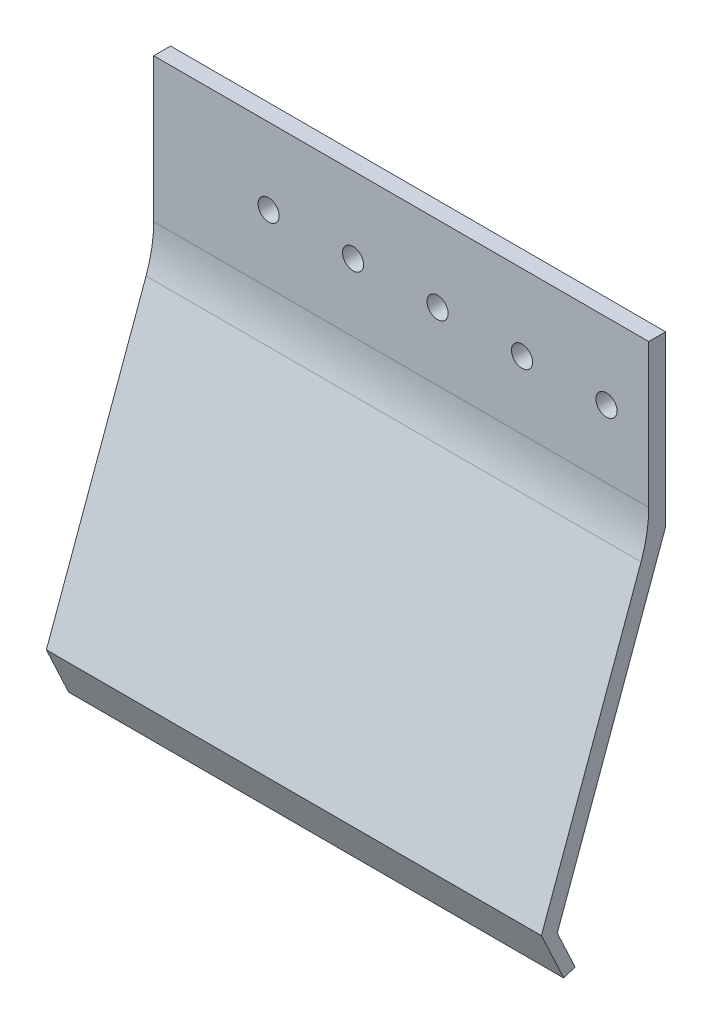
ISO-10303-21;
HEADER;
FILE_DESCRIPTION(('STEP AP214'),'2;1');
FILE_NAME('part.step','',(''),(''),'','','');
FILE_SCHEMA(('AUTOMOTIVE_DESIGN { 1 0 10303 214 1 1 1 1 }'));
ENDSEC;
DATA;
#1=APPLICATION_CONTEXT('core data for automotive mechanical design processes');
#2=APPLICATION_PROTOCOL_DEFINITION('international standard','automotive_design',2000,#1);
#3=PRODUCT_CONTEXT('',#1,'mechanical');
#4=PRODUCT('Part','Part','',(#3));
#5=PRODUCT_RELATED_PRODUCT_CATEGORY('part','',(#4));
#6=PRODUCT_DEFINITION_FORMATION('','',#4);
#7=PRODUCT_DEFINITION_CONTEXT('part definition',#1,'design');
#8=PRODUCT_DEFINITION('design','',#6,#7);
#9=PRODUCT_DEFINITION_SHAPE('','',#8);
#10=(LENGTH_UNIT() NAMED_UNIT(*) SI_UNIT(.MILLI.,.METRE.));
#11=(NAMED_UNIT(*) PLANE_ANGLE_UNIT() SI_UNIT($,.RADIAN.));
#12=(NAMED_UNIT(*) SI_UNIT($,.STERADIAN.) SOLID_ANGLE_UNIT());
#13=UNCERTAINTY_MEASURE_WITH_UNIT(LENGTH_MEASURE(1.E-05),#10,'distance_accuracy_value','');
#14=(GEOMETRIC_REPRESENTATION_CONTEXT(3) GLOBAL_UNCERTAINTY_ASSIGNED_CONTEXT((#13)) GLOBAL_UNIT_ASSIGNED_CONTEXT((#10,
#11,#12)) REPRESENTATION_CONTEXT('',''));
#15=CARTESIAN_POINT('',(0.,0.,0.));
#16=DIRECTION('',(0.,0.,1.));
#17=DIRECTION('',(1.,0.,0.));
#18=AXIS2_PLACEMENT_3D('',#15,#16,#17);
#19=CARTESIAN_POINT('',(37.2,0.,8.));
#20=DIRECTION('',(1.,0.,0.));
#21=DIRECTION('',(0.,0.,-1.));
#22=AXIS2_PLACEMENT_3D('',#19,#20,#21);
#23=PLANE('',#22);
#24=DIRECTION('',(0.,-1.,0.));
#25=VECTOR('',#24,1.);
#26=CARTESIAN_POINT('',(37.2,72.2,8.));
#27=LINE('',#26,#25);
#28=CARTESIAN_POINT('',(37.2,112.2,8.));
#29=VERTEX_POINT('',#28);
#30=CARTESIAN_POINT('',(37.2,72.2,8.));
#31=VERTEX_POINT('',#30);
#32=EDGE_CURVE('E166',#29,#31,#27,.T.);
#33=ORIENTED_EDGE('',*,*,#32,.F.);
#34=DIRECTION('',(0.,0.,1.));
#35=VECTOR('',#34,1.);
#36=CARTESIAN_POINT('',(37.2,112.2,0.));
#37=LINE('',#36,#35);
#38=CARTESIAN_POINT('',(37.2,112.2,12.));
#39=VERTEX_POINT('',#38);
#40=EDGE_CURVE('E11',#29,#39,#37,.T.);
#41=ORIENTED_EDGE('',*,*,#40,.T.);
#42=DIRECTION('',(0.,-1.,0.));
#43=VECTOR('',#42,1.);
#44=CARTESIAN_POINT('',(37.2,72.9053079228339,12.));
#45=LINE('',#44,#43);
#46=CARTESIAN_POINT('',(37.2,78.195117344088,12.));
#47=VERTEX_POINT('',#46);
#48=EDGE_CURVE('E112',#39,#47,#45,.T.);
#49=ORIENTED_EDGE('',*,*,#48,.T.);
#50=CARTESIAN_POINT('',(37.2,78.195117344088,42.));
#51=DIRECTION('',(-1.,0.,0.));
#52=DIRECTION('',(0.,0.,1.));
#53=AXIS2_PLACEMENT_3D('',#50,#51,#52);
#54=CIRCLE('',#53,30.);
#55=CARTESIAN_POINT('',(37.2,67.9345130443177,13.8092213764228));
#56=VERTEX_POINT('',#55);
#57=EDGE_CURVE('E45',#47,#56,#54,.T.);
#58=ORIENTED_EDGE('',*,*,#57,.T.);
#59=DIRECTION('',(0.,-0.939692620785906,0.342020143325676));
#60=VECTOR('',#59,1.);
#61=CARTESIAN_POINT('',(37.2,72.9053079228339,12.));
#62=LINE('',#61,#60);
#63=CARTESIAN_POINT('',(37.2,3.09113401435978,37.4102812325693));
#64=VERTEX_POINT('',#63);
#65=EDGE_CURVE('E170',#56,#64,#62,.T.);
#66=ORIENTED_EDGE('',*,*,#65,.T.);
#67=DIRECTION('',(0.,-0.906307787036651,-0.422618261740697));
#68=VECTOR('',#67,1.);
#69=CARTESIAN_POINT('',(37.2,3.09113401435978,37.4102812325693));
#70=LINE('',#69,#68);
#71=CARTESIAN_POINT('',(37.2,-8.23771332359837,32.1275529608106));
#72=VERTEX_POINT('',#71);
#73=EDGE_CURVE('E172',#64,#72,#70,.T.);
#74=ORIENTED_EDGE('',*,*,#73,.T.);
#75=DIRECTION('',(0.,0.315262717408907,-0.949004435717743));
#76=VECTOR('',#75,1.);
#77=CARTESIAN_POINT('',(37.2,-8.23771332359837,32.1275529608106));
#78=LINE('',#77,#76);
#79=CARTESIAN_POINT('',(37.2,-7.34002442930944,29.4253281320187));
#80=VERTEX_POINT('',#79);
#81=EDGE_CURVE('E175',#72,#80,#78,.T.);
#82=ORIENTED_EDGE('',*,*,#81,.T.);
#83=DIRECTION('',(0.,0.906307787036651,0.422618261740697));
#84=VECTOR('',#83,1.);
#85=CARTESIAN_POINT('',(37.2,1.72305344105708,33.6515107494257));
#86=LINE('',#85,#84);
#87=CARTESIAN_POINT('',(37.2,1.72305344105708,33.6515107494257));
#88=VERTEX_POINT('',#87);
#89=EDGE_CURVE('E178',#80,#88,#86,.T.);
#90=ORIENTED_EDGE('',*,*,#89,.T.);
#91=DIRECTION('',(0.,0.939692620785906,-0.342020143325676));
#92=VECTOR('',#91,1.);
#93=CARTESIAN_POINT('',(37.2,72.2,8.));
#94=LINE('',#93,#92);
#95=EDGE_CURVE('E116',#88,#31,#94,.T.);
#96=ORIENTED_EDGE('',*,*,#95,.T.);
#97=EDGE_LOOP('',(#33,#41,#49,#58,#66,#74,#82,#90,#96));
#98=FACE_BOUND('',#97,.T.);
#99=ADVANCED_FACE('F37',(#98),#23,.T.);
#100=CARTESIAN_POINT('',(-221.814036774629,112.2,0.));
#101=DIRECTION('',(0.,1.,0.));
#102=DIRECTION('',(0.,0.,1.));
#103=AXIS2_PLACEMENT_3D('',#100,#101,#102);
#104=PLANE('',#103);
#105=DIRECTION('',(1.,0.,0.));
#106=VECTOR('',#105,1.);
#107=CARTESIAN_POINT('',(-97.8,112.2,8.));
#108=LINE('',#107,#106);
#109=CARTESIAN_POINT('',(-80.,112.2,8.));
#110=VERTEX_POINT('',#109);
#111=EDGE_CURVE('E121',#110,#29,#108,.T.);
#112=ORIENTED_EDGE('',*,*,#111,.F.);
#113=DIRECTION('',(0.,0.,-1.));
#114=VECTOR('',#113,1.);
#115=CARTESIAN_POINT('',(-80.,112.2,12.));
#116=LINE('',#115,#114);
#117=CARTESIAN_POINT('',(-80.,112.2,12.));
#118=VERTEX_POINT('',#117);
#119=EDGE_CURVE('E119',#118,#110,#116,.T.);
#120=ORIENTED_EDGE('',*,*,#119,.F.);
#121=DIRECTION('',(1.,0.,0.));
#122=VECTOR('',#121,1.);
#123=CARTESIAN_POINT('',(-196.176640673943,112.2,12.));
#124=LINE('',#123,#122);
#125=EDGE_CURVE('E107',#118,#39,#124,.T.);
#126=ORIENTED_EDGE('',*,*,#125,.T.);
#127=ORIENTED_EDGE('',*,*,#40,.F.);
#128=EDGE_LOOP('',(#112,#120,#126,#127));
#129=FACE_BOUND('',#128,.T.);
#130=ADVANCED_FACE('F120',(#129),#104,.T.);
#131=CARTESIAN_POINT('',(-196.176640673943,72.2,8.));
#132=DIRECTION('',(0.,-0.342020143325676,-0.939692620785906));
#133=DIRECTION('',(0.,0.939692620785906,-0.342020143325676));
#134=AXIS2_PLACEMENT_3D('',#131,#132,#133);
#135=PLANE('',#134);
#136=DIRECTION('',(1.,0.,0.));
#137=VECTOR('',#136,1.);
#138=CARTESIAN_POINT('',(-196.176640673943,1.72305344105708,33.6515107494257));
#139=LINE('',#138,#137);
#140=CARTESIAN_POINT('',(-80.,1.72305344105708,33.6515107494257));
#141=VERTEX_POINT('',#140);
#142=EDGE_CURVE('E187',#141,#88,#139,.T.);
#143=ORIENTED_EDGE('',*,*,#142,.F.);
#144=DIRECTION('',(0.,-0.939692620785906,0.342020143325676));
#145=VECTOR('',#144,1.);
#146=CARTESIAN_POINT('',(-80.,72.2,8.));
#147=LINE('',#146,#145);
#148=CARTESIAN_POINT('',(-80.,72.2,8.));
#149=VERTEX_POINT('',#148);
#150=EDGE_CURVE('E135',#149,#141,#147,.T.);
#151=ORIENTED_EDGE('',*,*,#150,.F.);
#152=DIRECTION('',(1.,0.,0.));
#153=VECTOR('',#152,1.);
#154=CARTESIAN_POINT('',(-196.176640673943,72.2,8.));
#155=LINE('',#154,#153);
#156=EDGE_CURVE('E183',#149,#31,#155,.T.);
#157=ORIENTED_EDGE('',*,*,#156,.T.);
#158=ORIENTED_EDGE('',*,*,#95,.F.);
#159=EDGE_LOOP('',(#143,#151,#157,#158));
#160=FACE_BOUND('',#159,.T.);
#161=ADVANCED_FACE('F232',(#160),#135,.T.);
#162=CARTESIAN_POINT('',(-196.176640673943,1.72305344105708,33.6515107494257));
#163=DIRECTION('',(0.,0.422618261740697,-0.906307787036651));
#164=DIRECTION('',(0.,0.906307787036651,0.422618261740697));
#165=AXIS2_PLACEMENT_3D('',#162,#163,#164);
#166=PLANE('',#165);
#167=DIRECTION('',(1.,0.,0.));
#168=VECTOR('',#167,1.);
#169=CARTESIAN_POINT('',(-196.176640673943,-7.34002442930944,29.4253281320187));
#170=LINE('',#169,#168);
#171=CARTESIAN_POINT('',(-80.,-7.34002442930944,29.4253281320187));
#172=VERTEX_POINT('',#171);
#173=EDGE_CURVE('E189',#172,#80,#170,.T.);
#174=ORIENTED_EDGE('',*,*,#173,.F.);
#175=DIRECTION('',(0.,-0.906307787036651,-0.422618261740697));
#176=VECTOR('',#175,1.);
#177=CARTESIAN_POINT('',(-80.,1.72305344105708,33.6515107494257));
#178=LINE('',#177,#176);
#179=EDGE_CURVE('E138',#141,#172,#178,.T.);
#180=ORIENTED_EDGE('',*,*,#179,.F.);
#181=ORIENTED_EDGE('',*,*,#142,.T.);
#182=ORIENTED_EDGE('',*,*,#89,.F.);
#183=EDGE_LOOP('',(#174,#180,#181,#182));
#184=FACE_BOUND('',#183,.T.);
#185=ADVANCED_FACE('F241',(#184),#166,.T.);
#186=CARTESIAN_POINT('',(-196.176640673943,-8.23771332359837,32.1275529608106));
#187=DIRECTION('',(0.,-0.949004435717743,-0.315262717408907));
#188=DIRECTION('',(0.,0.315262717408907,-0.949004435717743));
#189=AXIS2_PLACEMENT_3D('',#186,#187,#188);
#190=PLANE('',#189);
#191=DIRECTION('',(1.,0.,0.));
#192=VECTOR('',#191,1.);
#193=CARTESIAN_POINT('',(-196.176640673943,-8.23771332359837,32.1275529608106));
#194=LINE('',#193,#192);
#195=CARTESIAN_POINT('',(-80.,-8.23771332359837,32.1275529608106));
#196=VERTEX_POINT('',#195);
#197=EDGE_CURVE('E191',#196,#72,#194,.T.);
#198=ORIENTED_EDGE('',*,*,#197,.F.);
#199=DIRECTION('',(0.,-0.315262717408907,0.949004435717743));
#200=VECTOR('',#199,1.);
#201=CARTESIAN_POINT('',(-80.,-7.34002442930944,29.4253281320187));
#202=LINE('',#201,#200);
#203=EDGE_CURVE('E141',#172,#196,#202,.T.);
#204=ORIENTED_EDGE('',*,*,#203,.F.);
#205=ORIENTED_EDGE('',*,*,#173,.T.);
#206=ORIENTED_EDGE('',*,*,#81,.F.);
#207=EDGE_LOOP('',(#198,#204,#205,#206));
#208=FACE_BOUND('',#207,.T.);
#209=ADVANCED_FACE('F245',(#208),#190,.T.);
#210=CARTESIAN_POINT('',(-196.176640673943,3.09113401435978,37.4102812325693));
#211=DIRECTION('',(0.,-0.422618261740697,0.906307787036651));
#212=DIRECTION('',(0.,-0.906307787036651,-0.422618261740697));
#213=AXIS2_PLACEMENT_3D('',#210,#211,#212);
#214=PLANE('',#213);
#215=DIRECTION('',(1.,0.,0.));
#216=VECTOR('',#215,1.);
#217=CARTESIAN_POINT('',(-196.176640673943,3.09113401435978,37.4102812325693));
#218=LINE('',#217,#216);
#219=CARTESIAN_POINT('',(-80.,3.09113401435979,37.4102812325693));
#220=VERTEX_POINT('',#219);
#221=EDGE_CURVE('E115',#220,#64,#218,.T.);
#222=ORIENTED_EDGE('',*,*,#221,.F.);
#223=DIRECTION('',(0.,0.906307787036651,0.422618261740697));
#224=VECTOR('',#223,1.);
#225=CARTESIAN_POINT('',(-80.,-8.23771332359837,32.1275529608106));
#226=LINE('',#225,#224);
#227=EDGE_CURVE('E144',#196,#220,#226,.T.);
#228=ORIENTED_EDGE('',*,*,#227,.F.);
#229=ORIENTED_EDGE('',*,*,#197,.T.);
#230=ORIENTED_EDGE('',*,*,#73,.F.);
#231=EDGE_LOOP('',(#222,#228,#229,#230));
#232=FACE_BOUND('',#231,.T.);
#233=ADVANCED_FACE('F249',(#232),#214,.T.);
#234=CARTESIAN_POINT('',(-196.176640673943,72.9053079228339,12.));
#235=DIRECTION('',(0.,0.342020143325676,0.939692620785906));
#236=DIRECTION('',(0.,-0.939692620785906,0.342020143325676));
#237=AXIS2_PLACEMENT_3D('',#234,#235,#236);
#238=PLANE('',#237);
#239=ORIENTED_EDGE('',*,*,#65,.F.);
#240=DIRECTION('',(1.,0.,0.));
#241=VECTOR('',#240,1.);
#242=CARTESIAN_POINT('',(-72.2,67.9345130443177,13.8092213764228));
#243=LINE('',#242,#241);
#244=CARTESIAN_POINT('',(-80.,67.9345130443177,13.8092213764228));
#245=VERTEX_POINT('',#244);
#246=EDGE_CURVE('E196',#56,#245,#243,.F.);
#247=ORIENTED_EDGE('',*,*,#246,.T.);
#248=DIRECTION('',(0.,0.939692620785906,-0.342020143325676));
#249=VECTOR('',#248,1.);
#250=CARTESIAN_POINT('',(-80.,3.09113401435979,37.4102812325693));
#251=LINE('',#250,#249);
#252=EDGE_CURVE('E147',#220,#245,#251,.T.);
#253=ORIENTED_EDGE('',*,*,#252,.F.);
#254=ORIENTED_EDGE('',*,*,#221,.T.);
#255=EDGE_LOOP('',(#239,#247,#253,#254));
#256=FACE_BOUND('',#255,.T.);
#257=ADVANCED_FACE('F252',(#256),#238,.T.);
#258=CARTESIAN_POINT('',(-196.176640673943,72.9053079228339,12.));
#259=DIRECTION('',(0.,0.,1.));
#260=DIRECTION('',(1.,0.,0.));
#261=AXIS2_PLACEMENT_3D('',#258,#259,#260);
#262=PLANE('',#261);
#263=CARTESIAN_POINT('',(-52.8,94.2,12.));
#264=DIRECTION('',(0.,0.,1.));
#265=DIRECTION('',(-1.,0.,0.));
#266=AXIS2_PLACEMENT_3D('',#263,#264,#265);
#267=CIRCLE('',#266,2.5);
#268=CARTESIAN_POINT('',(-55.3,94.2,12.));
#269=VERTEX_POINT('',#268);
#270=EDGE_CURVE('E151',#269,#269,#267,.T.);
#271=ORIENTED_EDGE('',*,*,#270,.F.);
#272=EDGE_LOOP('',(#271));
#273=FACE_BOUND('',#272,.T.);
#274=CARTESIAN_POINT('',(-32.8,94.2,12.));
#275=DIRECTION('',(0.,0.,1.));
#276=DIRECTION('',(-1.,0.,0.));
#277=AXIS2_PLACEMENT_3D('',#274,#275,#276);
#278=CIRCLE('',#277,2.5);
#279=CARTESIAN_POINT('',(-35.3,94.2,12.));
#280=VERTEX_POINT('',#279);
#281=EDGE_CURVE('E155',#280,#280,#278,.T.);
#282=ORIENTED_EDGE('',*,*,#281,.F.);
#283=EDGE_LOOP('',(#282));
#284=FACE_BOUND('',#283,.T.);
#285=CARTESIAN_POINT('',(-12.8,94.2,12.));
#286=DIRECTION('',(0.,0.,1.));
#287=DIRECTION('',(-1.,0.,0.));
#288=AXIS2_PLACEMENT_3D('',#285,#286,#287);
#289=CIRCLE('',#288,2.5);
#290=CARTESIAN_POINT('',(-15.3,94.2,12.));
#291=VERTEX_POINT('',#290);
#292=EDGE_CURVE('E158',#291,#291,#289,.T.);
#293=ORIENTED_EDGE('',*,*,#292,.F.);
#294=EDGE_LOOP('',(#293));
#295=FACE_BOUND('',#294,.T.);
#296=CARTESIAN_POINT('',(7.2,94.2,12.));
#297=DIRECTION('',(0.,0.,1.));
#298=DIRECTION('',(-1.,0.,0.));
#299=AXIS2_PLACEMENT_3D('',#296,#297,#298);
#300=CIRCLE('',#299,2.50000000000001);
#301=CARTESIAN_POINT('',(4.69999999999999,94.2,12.));
#302=VERTEX_POINT('',#301);
#303=EDGE_CURVE('E161',#302,#302,#300,.T.);
#304=ORIENTED_EDGE('',*,*,#303,.F.);
#305=EDGE_LOOP('',(#304));
#306=FACE_BOUND('',#305,.T.);
#307=CARTESIAN_POINT('',(27.2,94.2,12.));
#308=DIRECTION('',(0.,0.,1.));
#309=DIRECTION('',(-1.,0.,0.));
#310=AXIS2_PLACEMENT_3D('',#307,#308,#309);
#311=CIRCLE('',#310,2.5);
#312=CARTESIAN_POINT('',(24.7,94.2,12.));
#313=VERTEX_POINT('',#312);
#314=EDGE_CURVE('E150',#313,#313,#311,.T.);
#315=ORIENTED_EDGE('',*,*,#314,.F.);
#316=EDGE_LOOP('',(#315));
#317=FACE_BOUND('',#316,.T.);
#318=ORIENTED_EDGE('',*,*,#125,.F.);
#319=DIRECTION('',(0.,1.,0.));
#320=VECTOR('',#319,1.);
#321=CARTESIAN_POINT('',(-80.,78.195117344088,12.));
#322=LINE('',#321,#320);
#323=CARTESIAN_POINT('',(-80.,78.195117344088,12.));
#324=VERTEX_POINT('',#323);
#325=EDGE_CURVE('E111',#324,#118,#322,.T.);
#326=ORIENTED_EDGE('',*,*,#325,.F.);
#327=DIRECTION('',(1.,0.,0.));
#328=VECTOR('',#327,1.);
#329=CARTESIAN_POINT('',(37.2,78.195117344088,12.));
#330=LINE('',#329,#328);
#331=EDGE_CURVE('E186',#324,#47,#330,.T.);
#332=ORIENTED_EDGE('',*,*,#331,.T.);
#333=ORIENTED_EDGE('',*,*,#48,.F.);
#334=EDGE_LOOP('',(#318,#326,#332,#333));
#335=FACE_BOUND('',#334,.T.);
#336=ADVANCED_FACE('F109',(#273,#284,#295,#306,#317,#335),#262,.T.);
#337=CARTESIAN_POINT('',(-196.176640673943,78.195117344088,42.));
#338=DIRECTION('',(-1.,0.,0.));
#339=DIRECTION('',(0.,0.,1.));
#340=AXIS2_PLACEMENT_3D('',#337,#338,#339);
#341=CYLINDRICAL_SURFACE('',#340,30.);
#342=ORIENTED_EDGE('',*,*,#331,.F.);
#343=CARTESIAN_POINT('',(-80.,78.195117344088,42.));
#344=DIRECTION('',(1.,0.,0.));
#345=DIRECTION('',(0.,0.,1.));
#346=AXIS2_PLACEMENT_3D('',#343,#344,#345);
#347=CIRCLE('',#346,30.);
#348=EDGE_CURVE('E131',#245,#324,#347,.T.);
#349=ORIENTED_EDGE('',*,*,#348,.F.);
#350=ORIENTED_EDGE('',*,*,#246,.F.);
#351=ORIENTED_EDGE('',*,*,#57,.F.);
#352=EDGE_LOOP('',(#342,#349,#350,#351));
#353=FACE_BOUND('',#352,.T.);
#354=ADVANCED_FACE('F253',(#353),#341,.F.);
#355=CARTESIAN_POINT('',(-97.8,72.2,8.));
#356=DIRECTION('',(0.,0.,1.));
#357=DIRECTION('',(1.,0.,0.));
#358=AXIS2_PLACEMENT_3D('',#355,#356,#357);
#359=PLANE('',#358);
#360=CARTESIAN_POINT('',(-52.8,94.2,8.));
#361=DIRECTION('',(0.,0.,1.));
#362=DIRECTION('',(1.,0.,0.));
#363=AXIS2_PLACEMENT_3D('',#360,#361,#362);
#364=CIRCLE('',#363,2.5);
#365=CARTESIAN_POINT('',(-50.3,94.2,8.));
#366=VERTEX_POINT('',#365);
#367=EDGE_CURVE('E40',#366,#366,#364,.T.);
#368=ORIENTED_EDGE('',*,*,#367,.T.);
#369=EDGE_LOOP('',(#368));
#370=FACE_BOUND('',#369,.T.);
#371=CARTESIAN_POINT('',(-32.8,94.2,8.));
#372=DIRECTION('',(0.,0.,1.));
#373=DIRECTION('',(1.,0.,0.));
#374=AXIS2_PLACEMENT_3D('',#371,#372,#373);
#375=CIRCLE('',#374,2.5);
#376=CARTESIAN_POINT('',(-30.3,94.2,8.));
#377=VERTEX_POINT('',#376);
#378=EDGE_CURVE('E206',#377,#377,#375,.T.);
#379=ORIENTED_EDGE('',*,*,#378,.T.);
#380=EDGE_LOOP('',(#379));
#381=FACE_BOUND('',#380,.T.);
#382=CARTESIAN_POINT('',(-12.8,94.2,8.));
#383=DIRECTION('',(0.,0.,1.));
#384=DIRECTION('',(1.,0.,0.));
#385=AXIS2_PLACEMENT_3D('',#382,#383,#384);
#386=CIRCLE('',#385,2.5);
#387=CARTESIAN_POINT('',(-10.3,94.2,8.));
#388=VERTEX_POINT('',#387);
#389=EDGE_CURVE('E204',#388,#388,#386,.T.);
#390=ORIENTED_EDGE('',*,*,#389,.T.);
#391=EDGE_LOOP('',(#390));
#392=FACE_BOUND('',#391,.T.);
#393=CARTESIAN_POINT('',(7.2,94.2,8.));
#394=DIRECTION('',(0.,0.,1.));
#395=DIRECTION('',(1.,0.,0.));
#396=AXIS2_PLACEMENT_3D('',#393,#394,#395);
#397=CIRCLE('',#396,2.50000000000001);
#398=CARTESIAN_POINT('',(9.70000000000001,94.2,8.));
#399=VERTEX_POINT('',#398);
#400=EDGE_CURVE('E201',#399,#399,#397,.T.);
#401=ORIENTED_EDGE('',*,*,#400,.T.);
#402=EDGE_LOOP('',(#401));
#403=FACE_BOUND('',#402,.T.);
#404=CARTESIAN_POINT('',(27.2,94.2,8.));
#405=DIRECTION('',(0.,0.,1.));
#406=DIRECTION('',(1.,0.,0.));
#407=AXIS2_PLACEMENT_3D('',#404,#405,#406);
#408=CIRCLE('',#407,2.5);
#409=CARTESIAN_POINT('',(29.7,94.2,8.));
#410=VERTEX_POINT('',#409);
#411=EDGE_CURVE('E154',#410,#410,#408,.T.);
#412=ORIENTED_EDGE('',*,*,#411,.T.);
#413=EDGE_LOOP('',(#412));
#414=FACE_BOUND('',#413,.T.);
#415=ORIENTED_EDGE('',*,*,#111,.T.);
#416=ORIENTED_EDGE('',*,*,#32,.T.);
#417=ORIENTED_EDGE('',*,*,#156,.F.);
#418=DIRECTION('',(0.,-1.,0.));
#419=VECTOR('',#418,1.);
#420=CARTESIAN_POINT('',(-80.,112.2,8.));
#421=LINE('',#420,#419);
#422=EDGE_CURVE('E125',#110,#149,#421,.T.);
#423=ORIENTED_EDGE('',*,*,#422,.F.);
#424=EDGE_LOOP('',(#415,#416,#417,#423));
#425=FACE_BOUND('',#424,.T.);
#426=ADVANCED_FACE('F213',(#370,#381,#392,#403,#414,#425),#359,.F.);
#427=CARTESIAN_POINT('',(27.2,94.2,2.));
#428=DIRECTION('',(0.,0.,1.));
#429=DIRECTION('',(1.,0.,0.));
#430=AXIS2_PLACEMENT_3D('',#427,#428,#429);
#431=CYLINDRICAL_SURFACE('',#430,2.5);
#432=ORIENTED_EDGE('',*,*,#314,.T.);
#433=EDGE_LOOP('',(#432));
#434=FACE_BOUND('',#433,.T.);
#435=ORIENTED_EDGE('',*,*,#411,.F.);
#436=EDGE_LOOP('',(#435));
#437=FACE_BOUND('',#436,.T.);
#438=ADVANCED_FACE('F260',(#434,#437),#431,.F.);
#439=CARTESIAN_POINT('',(7.2,94.2,2.));
#440=DIRECTION('',(0.,0.,1.));
#441=DIRECTION('',(1.,0.,0.));
#442=AXIS2_PLACEMENT_3D('',#439,#440,#441);
#443=CYLINDRICAL_SURFACE('',#442,2.50000000000001);
#444=ORIENTED_EDGE('',*,*,#303,.T.);
#445=EDGE_LOOP('',(#444));
#446=FACE_BOUND('',#445,.T.);
#447=ORIENTED_EDGE('',*,*,#400,.F.);
#448=EDGE_LOOP('',(#447));
#449=FACE_BOUND('',#448,.T.);
#450=ADVANCED_FACE('F277',(#446,#449),#443,.F.);
#451=CARTESIAN_POINT('',(-12.8,94.2,2.));
#452=DIRECTION('',(0.,0.,1.));
#453=DIRECTION('',(1.,0.,0.));
#454=AXIS2_PLACEMENT_3D('',#451,#452,#453);
#455=CYLINDRICAL_SURFACE('',#454,2.5);
#456=ORIENTED_EDGE('',*,*,#292,.T.);
#457=EDGE_LOOP('',(#456));
#458=FACE_BOUND('',#457,.T.);
#459=ORIENTED_EDGE('',*,*,#389,.F.);
#460=EDGE_LOOP('',(#459));
#461=FACE_BOUND('',#460,.T.);
#462=ADVANCED_FACE('F225',(#458,#461),#455,.F.);
#463=CARTESIAN_POINT('',(-32.8,94.2,2.));
#464=DIRECTION('',(0.,0.,1.));
#465=DIRECTION('',(1.,0.,0.));
#466=AXIS2_PLACEMENT_3D('',#463,#464,#465);
#467=CYLINDRICAL_SURFACE('',#466,2.5);
#468=ORIENTED_EDGE('',*,*,#281,.T.);
#469=EDGE_LOOP('',(#468));
#470=FACE_BOUND('',#469,.T.);
#471=ORIENTED_EDGE('',*,*,#378,.F.);
#472=EDGE_LOOP('',(#471));
#473=FACE_BOUND('',#472,.T.);
#474=ADVANCED_FACE('F217',(#470,#473),#467,.F.);
#475=CARTESIAN_POINT('',(-52.8,94.2,2.));
#476=DIRECTION('',(0.,0.,1.));
#477=DIRECTION('',(1.,0.,0.));
#478=AXIS2_PLACEMENT_3D('',#475,#476,#477);
#479=CYLINDRICAL_SURFACE('',#478,2.5);
#480=ORIENTED_EDGE('',*,*,#270,.T.);
#481=EDGE_LOOP('',(#480));
#482=FACE_BOUND('',#481,.T.);
#483=ORIENTED_EDGE('',*,*,#367,.F.);
#484=EDGE_LOOP('',(#483));
#485=FACE_BOUND('',#484,.T.);
#486=ADVANCED_FACE('F215',(#482,#485),#479,.F.);
#487=CARTESIAN_POINT('',(-80.,78.195117344088,42.));
#488=DIRECTION('',(-1.,0.,0.));
#489=DIRECTION('',(0.,0.,1.));
#490=AXIS2_PLACEMENT_3D('',#487,#488,#489);
#491=PLANE('',#490);
#492=ORIENTED_EDGE('',*,*,#325,.T.);
#493=ORIENTED_EDGE('',*,*,#119,.T.);
#494=ORIENTED_EDGE('',*,*,#422,.T.);
#495=ORIENTED_EDGE('',*,*,#150,.T.);
#496=ORIENTED_EDGE('',*,*,#179,.T.);
#497=ORIENTED_EDGE('',*,*,#203,.T.);
#498=ORIENTED_EDGE('',*,*,#227,.T.);
#499=ORIENTED_EDGE('',*,*,#252,.T.);
#500=ORIENTED_EDGE('',*,*,#348,.T.);
#501=EDGE_LOOP('',(#492,#493,#494,#495,#496,#497,#498,#499,#500));
#502=FACE_BOUND('',#501,.T.);
#503=ADVANCED_FACE('F128',(#502),#491,.T.);
#504=CLOSED_SHELL('',(#99,#130,#161,#185,#209,#233,#257,#336,#354,#426,#438,#450,#462,#474,#486,#503));
#505=MANIFOLD_SOLID_BREP('B2',#504);
#506=ADVANCED_BREP_SHAPE_REPRESENTATION('',(#18,#505),#14);
#507=SHAPE_DEFINITION_REPRESENTATION(#9,#506);
ENDSEC;
END-ISO-10303-21;
